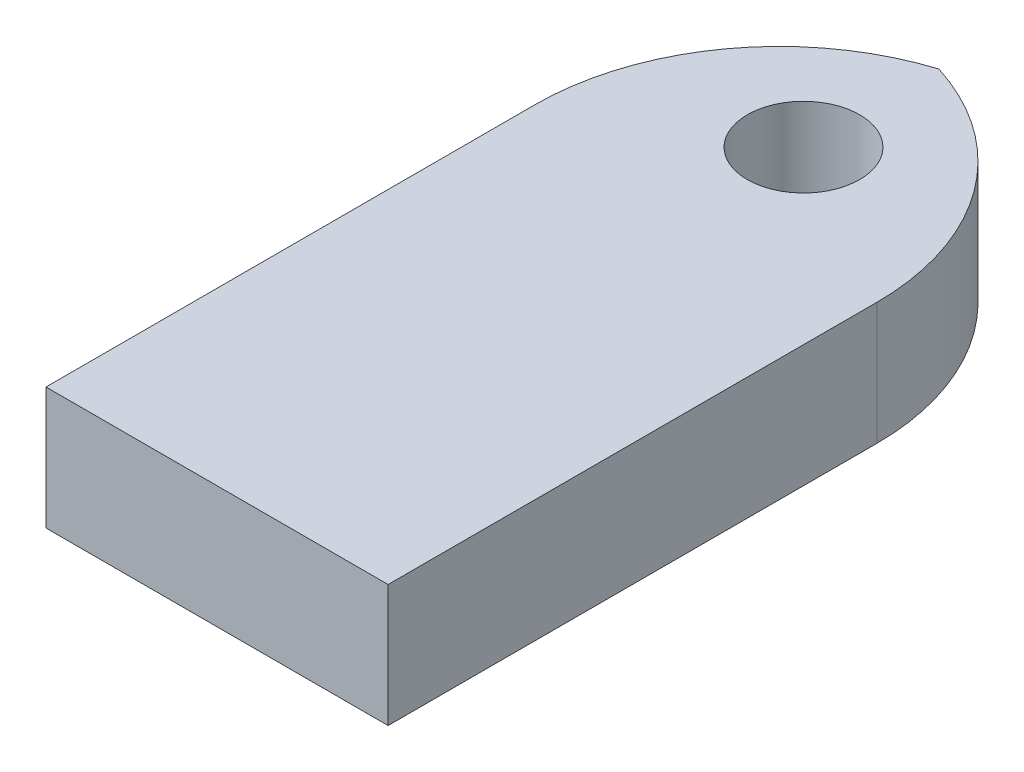
ISO-10303-21;
HEADER;
FILE_DESCRIPTION(('STEP AP214'),'2;1');
FILE_NAME('part.step','',(''),(''),'','','');
FILE_SCHEMA(('AUTOMOTIVE_DESIGN { 1 0 10303 214 1 1 1 1 }'));
ENDSEC;
DATA;
#1=APPLICATION_CONTEXT('core data for automotive mechanical design processes');
#2=APPLICATION_PROTOCOL_DEFINITION('international standard','automotive_design',2000,#1);
#3=PRODUCT_CONTEXT('',#1,'mechanical');
#4=PRODUCT('Part','Part','',(#3));
#5=PRODUCT_RELATED_PRODUCT_CATEGORY('part','',(#4));
#6=PRODUCT_DEFINITION_FORMATION('','',#4);
#7=PRODUCT_DEFINITION_CONTEXT('part definition',#1,'design');
#8=PRODUCT_DEFINITION('design','',#6,#7);
#9=PRODUCT_DEFINITION_SHAPE('','',#8);
#10=(LENGTH_UNIT() NAMED_UNIT(*) SI_UNIT(.MILLI.,.METRE.));
#11=(NAMED_UNIT(*) PLANE_ANGLE_UNIT() SI_UNIT($,.RADIAN.));
#12=(NAMED_UNIT(*) SI_UNIT($,.STERADIAN.) SOLID_ANGLE_UNIT());
#13=UNCERTAINTY_MEASURE_WITH_UNIT(LENGTH_MEASURE(1.E-05),#10,'distance_accuracy_value','');
#14=(GEOMETRIC_REPRESENTATION_CONTEXT(3) GLOBAL_UNCERTAINTY_ASSIGNED_CONTEXT((#13)) GLOBAL_UNIT_ASSIGNED_CONTEXT((#10,
#11,#12)) REPRESENTATION_CONTEXT('',''));
#15=CARTESIAN_POINT('',(0.,0.,0.));
#16=DIRECTION('',(0.,0.,1.));
#17=DIRECTION('',(1.,0.,0.));
#18=AXIS2_PLACEMENT_3D('',#15,#16,#17);
#19=CARTESIAN_POINT('',(0.,3.175,0.));
#20=DIRECTION('',(0.,-1.,0.));
#21=DIRECTION('',(0.,0.,-1.));
#22=AXIS2_PLACEMENT_3D('',#19,#20,#21);
#23=PLANE('',#22);
#24=DIRECTION('',(0.,0.,-1.));
#25=VECTOR('',#24,1.);
#26=CARTESIAN_POINT('',(8.89,3.175,0.));
#27=LINE('',#26,#25);
#28=CARTESIAN_POINT('',(8.89,3.175,0.));
#29=VERTEX_POINT('',#28);
#30=CARTESIAN_POINT('',(8.89,3.175,-12.7));
#31=VERTEX_POINT('',#30);
#32=EDGE_CURVE('E97',#29,#31,#27,.T.);
#33=ORIENTED_EDGE('',*,*,#32,.T.);
#34=CARTESIAN_POINT('',(2.54,3.175,-12.7));
#35=DIRECTION('',(0.,-1.,0.));
#36=DIRECTION('',(0.,0.,-1.));
#37=AXIS2_PLACEMENT_3D('',#34,#35,#36);
#38=CIRCLE('',#37,6.35);
#39=CARTESIAN_POINT('',(4.445,3.175,-18.7575139289976));
#40=VERTEX_POINT('',#39);
#41=EDGE_CURVE('E48',#31,#40,#38,.F.);
#42=ORIENTED_EDGE('',*,*,#41,.T.);
#43=CARTESIAN_POINT('',(6.35,3.175,-12.7));
#44=DIRECTION('',(0.,-1.,0.));
#45=DIRECTION('',(0.,0.,-1.));
#46=AXIS2_PLACEMENT_3D('',#43,#44,#45);
#47=CIRCLE('',#46,6.35);
#48=CARTESIAN_POINT('',(0.,3.175,-12.7));
#49=VERTEX_POINT('',#48);
#50=EDGE_CURVE('E58',#40,#49,#47,.F.);
#51=ORIENTED_EDGE('',*,*,#50,.T.);
#52=DIRECTION('',(0.,0.,1.));
#53=VECTOR('',#52,1.);
#54=CARTESIAN_POINT('',(0.,3.175,0.));
#55=LINE('',#54,#53);
#56=CARTESIAN_POINT('',(0.,3.175,0.));
#57=VERTEX_POINT('',#56);
#58=EDGE_CURVE('E80',#49,#57,#55,.T.);
#59=ORIENTED_EDGE('',*,*,#58,.T.);
#60=DIRECTION('',(1.,0.,0.));
#61=VECTOR('',#60,1.);
#62=CARTESIAN_POINT('',(0.,3.175,0.));
#63=LINE('',#62,#61);
#64=EDGE_CURVE('E83',#57,#29,#63,.T.);
#65=ORIENTED_EDGE('',*,*,#64,.T.);
#66=EDGE_LOOP('',(#33,#42,#51,#59,#65));
#67=FACE_BOUND('',#66,.T.);
#68=CARTESIAN_POINT('',(4.445,3.175,-15.24));
#69=DIRECTION('',(0.,1.,0.));
#70=DIRECTION('',(0.,0.,1.));
#71=AXIS2_PLACEMENT_3D('',#68,#69,#70);
#72=CIRCLE('',#71,1.4605);
#73=CARTESIAN_POINT('',(4.445,3.175,-13.7795));
#74=VERTEX_POINT('',#73);
#75=EDGE_CURVE('E126',#74,#74,#72,.T.);
#76=ORIENTED_EDGE('',*,*,#75,.F.);
#77=EDGE_LOOP('',(#76));
#78=FACE_BOUND('',#77,.T.);
#79=ADVANCED_FACE('F39',(#67,#78),#23,.F.);
#80=CARTESIAN_POINT('',(0.,0.,0.));
#81=DIRECTION('',(0.,-1.,0.));
#82=DIRECTION('',(0.,0.,-1.));
#83=AXIS2_PLACEMENT_3D('',#80,#81,#82);
#84=PLANE('',#83);
#85=CARTESIAN_POINT('',(6.35,0.,-12.7));
#86=DIRECTION('',(0.,-1.,0.));
#87=DIRECTION('',(0.,0.,-1.));
#88=AXIS2_PLACEMENT_3D('',#85,#86,#87);
#89=CIRCLE('',#88,6.35);
#90=CARTESIAN_POINT('',(0.,0.,-12.7));
#91=VERTEX_POINT('',#90);
#92=CARTESIAN_POINT('',(4.445,0.,-18.7575139289976));
#93=VERTEX_POINT('',#92);
#94=EDGE_CURVE('E103',#91,#93,#89,.T.);
#95=ORIENTED_EDGE('',*,*,#94,.T.);
#96=CARTESIAN_POINT('',(2.54,0.,-12.7));
#97=DIRECTION('',(0.,-1.,0.));
#98=DIRECTION('',(0.,0.,-1.));
#99=AXIS2_PLACEMENT_3D('',#96,#97,#98);
#100=CIRCLE('',#99,6.35);
#101=CARTESIAN_POINT('',(8.89,0.,-12.7));
#102=VERTEX_POINT('',#101);
#103=EDGE_CURVE('E105',#93,#102,#100,.T.);
#104=ORIENTED_EDGE('',*,*,#103,.T.);
#105=DIRECTION('',(0.,0.,-1.));
#106=VECTOR('',#105,1.);
#107=CARTESIAN_POINT('',(8.89,0.,0.));
#108=LINE('',#107,#106);
#109=CARTESIAN_POINT('',(8.89,0.,0.));
#110=VERTEX_POINT('',#109);
#111=EDGE_CURVE('E88',#110,#102,#108,.T.);
#112=ORIENTED_EDGE('',*,*,#111,.F.);
#113=DIRECTION('',(1.,0.,0.));
#114=VECTOR('',#113,1.);
#115=CARTESIAN_POINT('',(0.,0.,0.));
#116=LINE('',#115,#114);
#117=CARTESIAN_POINT('',(0.,0.,0.));
#118=VERTEX_POINT('',#117);
#119=EDGE_CURVE('E125',#118,#110,#116,.T.);
#120=ORIENTED_EDGE('',*,*,#119,.F.);
#121=DIRECTION('',(0.,0.,1.));
#122=VECTOR('',#121,1.);
#123=CARTESIAN_POINT('',(0.,0.,0.));
#124=LINE('',#123,#122);
#125=EDGE_CURVE('E101',#91,#118,#124,.T.);
#126=ORIENTED_EDGE('',*,*,#125,.F.);
#127=EDGE_LOOP('',(#95,#104,#112,#120,#126));
#128=FACE_BOUND('',#127,.T.);
#129=CARTESIAN_POINT('',(4.445,0.,-15.24));
#130=DIRECTION('',(0.,1.,0.));
#131=DIRECTION('',(0.,0.,1.));
#132=AXIS2_PLACEMENT_3D('',#129,#130,#131);
#133=CIRCLE('',#132,1.4605);
#134=CARTESIAN_POINT('',(4.445,0.,-13.7795));
#135=VERTEX_POINT('',#134);
#136=EDGE_CURVE('E135',#135,#135,#133,.T.);
#137=ORIENTED_EDGE('',*,*,#136,.T.);
#138=EDGE_LOOP('',(#137));
#139=FACE_BOUND('',#138,.T.);
#140=ADVANCED_FACE('F128',(#128,#139),#84,.T.);
#141=CARTESIAN_POINT('',(0.,3.175,0.));
#142=DIRECTION('',(1.,0.,0.));
#143=DIRECTION('',(0.,0.,-1.));
#144=AXIS2_PLACEMENT_3D('',#141,#142,#143);
#145=PLANE('',#144);
#146=ORIENTED_EDGE('',*,*,#58,.F.);
#147=DIRECTION('',(0.,-1.,0.));
#148=VECTOR('',#147,1.);
#149=CARTESIAN_POINT('',(0.,3.175,-12.7));
#150=LINE('',#149,#148);
#151=EDGE_CURVE('E11',#49,#91,#150,.T.);
#152=ORIENTED_EDGE('',*,*,#151,.T.);
#153=ORIENTED_EDGE('',*,*,#125,.T.);
#154=DIRECTION('',(0.,-1.,0.));
#155=VECTOR('',#154,1.);
#156=CARTESIAN_POINT('',(0.,3.175,0.));
#157=LINE('',#156,#155);
#158=EDGE_CURVE('E93',#57,#118,#157,.T.);
#159=ORIENTED_EDGE('',*,*,#158,.F.);
#160=EDGE_LOOP('',(#146,#152,#153,#159));
#161=FACE_BOUND('',#160,.T.);
#162=ADVANCED_FACE('F99',(#161),#145,.F.);
#163=CARTESIAN_POINT('',(0.,3.175,0.));
#164=DIRECTION('',(0.,0.,-1.));
#165=DIRECTION('',(-1.,0.,0.));
#166=AXIS2_PLACEMENT_3D('',#163,#164,#165);
#167=PLANE('',#166);
#168=ORIENTED_EDGE('',*,*,#119,.T.);
#169=DIRECTION('',(0.,-1.,0.));
#170=VECTOR('',#169,1.);
#171=CARTESIAN_POINT('',(8.89,3.175,0.));
#172=LINE('',#171,#170);
#173=EDGE_CURVE('E95',#29,#110,#172,.T.);
#174=ORIENTED_EDGE('',*,*,#173,.F.);
#175=ORIENTED_EDGE('',*,*,#64,.F.);
#176=ORIENTED_EDGE('',*,*,#158,.T.);
#177=EDGE_LOOP('',(#168,#174,#175,#176));
#178=FACE_BOUND('',#177,.T.);
#179=ADVANCED_FACE('F92',(#178),#167,.F.);
#180=CARTESIAN_POINT('',(8.89,3.175,0.));
#181=DIRECTION('',(-1.,0.,0.));
#182=DIRECTION('',(0.,0.,1.));
#183=AXIS2_PLACEMENT_3D('',#180,#181,#182);
#184=PLANE('',#183);
#185=ORIENTED_EDGE('',*,*,#111,.T.);
#186=DIRECTION('',(0.,-1.,0.));
#187=VECTOR('',#186,1.);
#188=CARTESIAN_POINT('',(8.89,3.175,-12.7));
#189=LINE('',#188,#187);
#190=EDGE_CURVE('E111',#102,#31,#189,.F.);
#191=ORIENTED_EDGE('',*,*,#190,.T.);
#192=ORIENTED_EDGE('',*,*,#32,.F.);
#193=ORIENTED_EDGE('',*,*,#173,.T.);
#194=EDGE_LOOP('',(#185,#191,#192,#193));
#195=FACE_BOUND('',#194,.T.);
#196=ADVANCED_FACE('F118',(#195),#184,.F.);
#197=CARTESIAN_POINT('',(4.445,3.175,-15.24));
#198=DIRECTION('',(0.,-1.,0.));
#199=DIRECTION('',(0.,0.,-1.));
#200=AXIS2_PLACEMENT_3D('',#197,#198,#199);
#201=CYLINDRICAL_SURFACE('',#200,1.4605);
#202=ORIENTED_EDGE('',*,*,#75,.T.);
#203=EDGE_LOOP('',(#202));
#204=FACE_BOUND('',#203,.T.);
#205=ORIENTED_EDGE('',*,*,#136,.F.);
#206=EDGE_LOOP('',(#205));
#207=FACE_BOUND('',#206,.T.);
#208=ADVANCED_FACE('F143',(#204,#207),#201,.F.);
#209=CARTESIAN_POINT('',(6.35,3.175,-12.7));
#210=DIRECTION('',(0.,-1.,0.));
#211=DIRECTION('',(0.,0.,-1.));
#212=AXIS2_PLACEMENT_3D('',#209,#210,#211);
#213=CYLINDRICAL_SURFACE('',#212,6.35);
#214=ORIENTED_EDGE('',*,*,#151,.F.);
#215=ORIENTED_EDGE('',*,*,#50,.F.);
#216=DIRECTION('',(0.,-1.,0.));
#217=VECTOR('',#216,1.);
#218=CARTESIAN_POINT('',(4.445,1.5875,-18.7575139289976));
#219=LINE('',#218,#217);
#220=EDGE_CURVE('E43',#93,#40,#219,.F.);
#221=ORIENTED_EDGE('',*,*,#220,.F.);
#222=ORIENTED_EDGE('',*,*,#94,.F.);
#223=EDGE_LOOP('',(#214,#215,#221,#222));
#224=FACE_BOUND('',#223,.T.);
#225=ADVANCED_FACE('F41',(#224),#213,.T.);
#226=CARTESIAN_POINT('',(2.54,3.175,-12.7));
#227=DIRECTION('',(0.,-1.,0.));
#228=DIRECTION('',(0.,0.,-1.));
#229=AXIS2_PLACEMENT_3D('',#226,#227,#228);
#230=CYLINDRICAL_SURFACE('',#229,6.35);
#231=ORIENTED_EDGE('',*,*,#41,.F.);
#232=ORIENTED_EDGE('',*,*,#190,.F.);
#233=ORIENTED_EDGE('',*,*,#103,.F.);
#234=ORIENTED_EDGE('',*,*,#220,.T.);
#235=EDGE_LOOP('',(#231,#232,#233,#234));
#236=FACE_BOUND('',#235,.T.);
#237=ADVANCED_FACE('F133',(#236),#230,.T.);
#238=CLOSED_SHELL('',(#79,#140,#162,#179,#196,#208,#225,#237));
#239=MANIFOLD_SOLID_BREP('B2',#238);
#240=ADVANCED_BREP_SHAPE_REPRESENTATION('',(#18,#239),#14);
#241=SHAPE_DEFINITION_REPRESENTATION(#9,#240);
ENDSEC;
END-ISO-10303-21;
